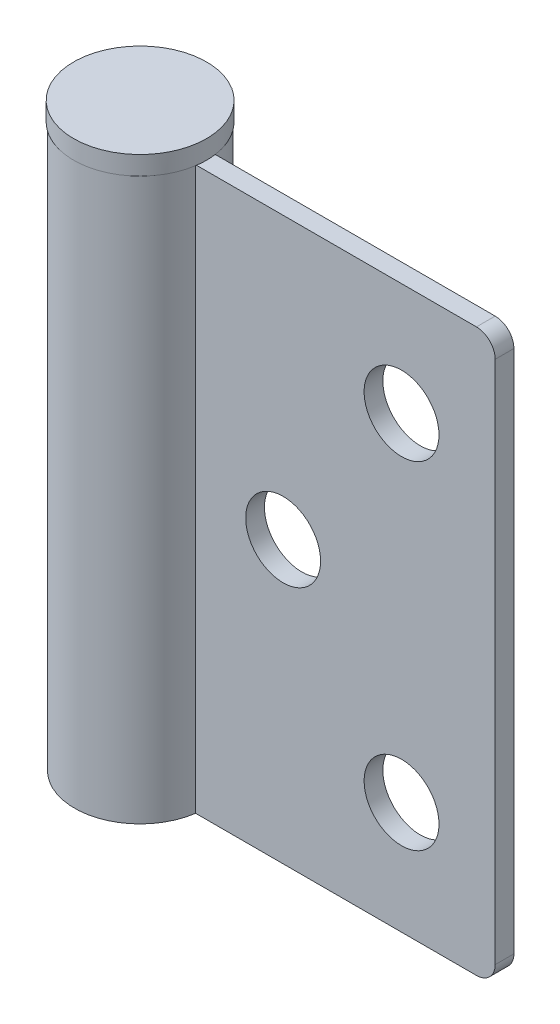
ISO-10303-21;
HEADER;
FILE_DESCRIPTION(('STEP AP214'),'2;1');
FILE_NAME('part.step','',(''),(''),'','','');
FILE_SCHEMA(('AUTOMOTIVE_DESIGN { 1 0 10303 214 1 1 1 1 }'));
ENDSEC;
DATA;
#1=APPLICATION_CONTEXT('core data for automotive mechanical design processes');
#2=APPLICATION_PROTOCOL_DEFINITION('international standard','automotive_design',2000,#1);
#3=PRODUCT_CONTEXT('',#1,'mechanical');
#4=PRODUCT('Part','Part','',(#3));
#5=PRODUCT_RELATED_PRODUCT_CATEGORY('part','',(#4));
#6=PRODUCT_DEFINITION_FORMATION('','',#4);
#7=PRODUCT_DEFINITION_CONTEXT('part definition',#1,'design');
#8=PRODUCT_DEFINITION('design','',#6,#7);
#9=PRODUCT_DEFINITION_SHAPE('','',#8);
#10=(LENGTH_UNIT() NAMED_UNIT(*) SI_UNIT(.MILLI.,.METRE.));
#11=(NAMED_UNIT(*) PLANE_ANGLE_UNIT() SI_UNIT($,.RADIAN.));
#12=(NAMED_UNIT(*) SI_UNIT($,.STERADIAN.) SOLID_ANGLE_UNIT());
#13=UNCERTAINTY_MEASURE_WITH_UNIT(LENGTH_MEASURE(1.E-05),#10,'distance_accuracy_value','');
#14=(GEOMETRIC_REPRESENTATION_CONTEXT(3) GLOBAL_UNCERTAINTY_ASSIGNED_CONTEXT((#13)) GLOBAL_UNIT_ASSIGNED_CONTEXT((#10,
#11,#12)) REPRESENTATION_CONTEXT('',''));
#15=CARTESIAN_POINT('',(0.,0.,0.));
#16=DIRECTION('',(0.,0.,1.));
#17=DIRECTION('',(1.,0.,0.));
#18=AXIS2_PLACEMENT_3D('',#15,#16,#17);
#19=CARTESIAN_POINT('',(0.,30.,0.));
#20=DIRECTION('',(0.,1.,0.));
#21=DIRECTION('',(0.,0.,1.));
#22=AXIS2_PLACEMENT_3D('',#19,#20,#21);
#23=PLANE('',#22);
#24=DIRECTION('',(-1.,0.,0.));
#25=VECTOR('',#24,1.);
#26=CARTESIAN_POINT('',(19.4641016151378,30.,-0.500000000000001));
#27=LINE('',#26,#25);
#28=CARTESIAN_POINT('',(18.4641016151378,30.,-0.500000000000001));
#29=VERTEX_POINT('',#28);
#30=CARTESIAN_POINT('',(3.514612354158,30.,-0.499999999999999));
#31=VERTEX_POINT('',#30);
#32=EDGE_CURVE('E111',#29,#31,#27,.T.);
#33=ORIENTED_EDGE('',*,*,#32,.T.);
#34=CARTESIAN_POINT('',(0.,30.,0.));
#35=DIRECTION('',(0.,1.,0.));
#36=DIRECTION('',(0.,0.,1.));
#37=AXIS2_PLACEMENT_3D('',#34,#35,#36);
#38=CIRCLE('',#37,3.55);
#39=CARTESIAN_POINT('',(3.514612354158,30.,0.500000000000001));
#40=VERTEX_POINT('',#39);
#41=EDGE_CURVE('E50',#40,#31,#38,.T.);
#42=ORIENTED_EDGE('',*,*,#41,.F.);
#43=DIRECTION('',(1.,0.,0.));
#44=VECTOR('',#43,1.);
#45=CARTESIAN_POINT('',(19.4641016151378,30.,0.499999999999999));
#46=LINE('',#45,#44);
#47=CARTESIAN_POINT('',(18.4641016151378,30.,0.499999999999999));
#48=VERTEX_POINT('',#47);
#49=EDGE_CURVE('E105',#40,#48,#46,.T.);
#50=ORIENTED_EDGE('',*,*,#49,.T.);
#51=DIRECTION('',(0.,0.,-1.));
#52=VECTOR('',#51,1.);
#53=CARTESIAN_POINT('',(18.4641016151378,30.,-0.500000000000001));
#54=LINE('',#53,#52);
#55=EDGE_CURVE('E160',#48,#29,#54,.T.);
#56=ORIENTED_EDGE('',*,*,#55,.T.);
#57=EDGE_LOOP('',(#33,#42,#50,#56));
#58=FACE_BOUND('',#57,.T.);
#59=ADVANCED_FACE('F35',(#58),#23,.T.);
#60=CARTESIAN_POINT('',(0.,0.,0.));
#61=DIRECTION('',(0.,1.,0.));
#62=DIRECTION('',(0.,0.,1.));
#63=AXIS2_PLACEMENT_3D('',#60,#61,#62);
#64=PLANE('',#63);
#65=DIRECTION('',(-1.,0.,0.));
#66=VECTOR('',#65,1.);
#67=CARTESIAN_POINT('',(19.4641016151378,0.,-0.500000000000001));
#68=LINE('',#67,#66);
#69=CARTESIAN_POINT('',(18.4641016151378,0.,-0.500000000000001));
#70=VERTEX_POINT('',#69);
#71=CARTESIAN_POINT('',(3.46410161513775,0.,-0.499999999999999));
#72=VERTEX_POINT('',#71);
#73=EDGE_CURVE('E106',#70,#72,#68,.T.);
#74=ORIENTED_EDGE('',*,*,#73,.F.);
#75=DIRECTION('',(0.,0.,-1.));
#76=VECTOR('',#75,1.);
#77=CARTESIAN_POINT('',(18.4641016151378,0.,0.));
#78=LINE('',#77,#76);
#79=CARTESIAN_POINT('',(18.4641016151378,0.,0.499999999999999));
#80=VERTEX_POINT('',#79);
#81=EDGE_CURVE('E11',#70,#80,#78,.F.);
#82=ORIENTED_EDGE('',*,*,#81,.T.);
#83=DIRECTION('',(1.,0.,0.));
#84=VECTOR('',#83,1.);
#85=CARTESIAN_POINT('',(19.4641016151378,0.,0.499999999999999));
#86=LINE('',#85,#84);
#87=CARTESIAN_POINT('',(3.46410161513776,0.,0.500000000000001));
#88=VERTEX_POINT('',#87);
#89=EDGE_CURVE('E150',#88,#80,#86,.T.);
#90=ORIENTED_EDGE('',*,*,#89,.F.);
#91=CARTESIAN_POINT('',(0.,0.,0.));
#92=DIRECTION('',(0.,1.,0.));
#93=DIRECTION('',(0.,0.,1.));
#94=AXIS2_PLACEMENT_3D('',#91,#92,#93);
#95=CIRCLE('',#94,3.5);
#96=EDGE_CURVE('E144',#72,#88,#95,.T.);
#97=ORIENTED_EDGE('',*,*,#96,.F.);
#98=EDGE_LOOP('',(#74,#82,#90,#97));
#99=FACE_BOUND('',#98,.T.);
#100=CARTESIAN_POINT('',(0.,0.,0.));
#101=DIRECTION('',(0.,1.,0.));
#102=DIRECTION('',(0.,0.,1.));
#103=AXIS2_PLACEMENT_3D('',#100,#101,#102);
#104=CIRCLE('',#103,2.5);
#105=CARTESIAN_POINT('',(0.,0.,2.5));
#106=VERTEX_POINT('',#105);
#107=EDGE_CURVE('E135',#106,#106,#104,.T.);
#108=ORIENTED_EDGE('',*,*,#107,.T.);
#109=EDGE_LOOP('',(#108));
#110=FACE_BOUND('',#109,.T.);
#111=ADVANCED_FACE('F190',(#99,#110),#64,.F.);
#112=CARTESIAN_POINT('',(0.,30.,0.));
#113=DIRECTION('',(0.,-1.,0.));
#114=DIRECTION('',(0.,0.,-1.));
#115=AXIS2_PLACEMENT_3D('',#112,#113,#114);
#116=CYLINDRICAL_SURFACE('',#115,3.5);
#117=ORIENTED_EDGE('',*,*,#96,.T.);
#118=DIRECTION('',(0.,-1.,0.));
#119=VECTOR('',#118,1.);
#120=CARTESIAN_POINT('',(3.46410161513776,30.,0.500000000000001));
#121=LINE('',#120,#119);
#122=CARTESIAN_POINT('',(3.46410161513776,30.,0.500000000000001));
#123=VERTEX_POINT('',#122);
#124=EDGE_CURVE('E102',#123,#88,#121,.T.);
#125=ORIENTED_EDGE('',*,*,#124,.F.);
#126=CARTESIAN_POINT('',(0.,30.,0.));
#127=DIRECTION('',(0.,1.,0.));
#128=DIRECTION('',(0.,0.,1.));
#129=AXIS2_PLACEMENT_3D('',#126,#127,#128);
#130=CIRCLE('',#129,3.5);
#131=CARTESIAN_POINT('',(3.46410161513776,30.,-0.499999999999999));
#132=VERTEX_POINT('',#131);
#133=EDGE_CURVE('E96',#132,#123,#130,.T.);
#134=ORIENTED_EDGE('',*,*,#133,.F.);
#135=DIRECTION('',(0.,-1.,0.));
#136=VECTOR('',#135,1.);
#137=CARTESIAN_POINT('',(3.46410161513775,30.,-0.499999999999999));
#138=LINE('',#137,#136);
#139=EDGE_CURVE('E99',#132,#72,#138,.T.);
#140=ORIENTED_EDGE('',*,*,#139,.T.);
#141=EDGE_LOOP('',(#117,#125,#134,#140));
#142=FACE_BOUND('',#141,.T.);
#143=ADVANCED_FACE('F98',(#142),#116,.T.);
#144=CARTESIAN_POINT('',(19.4641016151378,30.,0.499999999999999));
#145=DIRECTION('',(0.,0.,-1.));
#146=DIRECTION('',(-1.,0.,0.));
#147=AXIS2_PLACEMENT_3D('',#144,#145,#146);
#148=PLANE('',#147);
#149=CARTESIAN_POINT('',(14.4641016151377,24.,0.500000000000001));
#150=DIRECTION('',(0.,0.,1.));
#151=DIRECTION('',(1.,0.,0.));
#152=AXIS2_PLACEMENT_3D('',#149,#150,#151);
#153=CIRCLE('',#152,2.);
#154=CARTESIAN_POINT('',(16.4641016151377,24.,0.500000000000001));
#155=VERTEX_POINT('',#154);
#156=EDGE_CURVE('E128',#155,#155,#153,.T.);
#157=ORIENTED_EDGE('',*,*,#156,.F.);
#158=EDGE_LOOP('',(#157));
#159=FACE_BOUND('',#158,.T.);
#160=CARTESIAN_POINT('',(8.13954629480099,15.,0.500000000000001));
#161=DIRECTION('',(0.,0.,1.));
#162=DIRECTION('',(1.,0.,0.));
#163=AXIS2_PLACEMENT_3D('',#160,#161,#162);
#164=CIRCLE('',#163,2.);
#165=CARTESIAN_POINT('',(10.139546294801,15.,0.500000000000001));
#166=VERTEX_POINT('',#165);
#167=EDGE_CURVE('E136',#166,#166,#164,.T.);
#168=ORIENTED_EDGE('',*,*,#167,.F.);
#169=EDGE_LOOP('',(#168));
#170=FACE_BOUND('',#169,.T.);
#171=CARTESIAN_POINT('',(14.4641016151378,6.,0.500000000000001));
#172=DIRECTION('',(0.,0.,1.));
#173=DIRECTION('',(-1.,0.,0.));
#174=AXIS2_PLACEMENT_3D('',#171,#172,#173);
#175=CIRCLE('',#174,2.);
#176=CARTESIAN_POINT('',(12.4641016151377,6.,0.500000000000001));
#177=VERTEX_POINT('',#176);
#178=EDGE_CURVE('E117',#177,#177,#175,.T.);
#179=ORIENTED_EDGE('',*,*,#178,.F.);
#180=EDGE_LOOP('',(#179));
#181=FACE_BOUND('',#180,.T.);
#182=DIRECTION('',(0.,-1.,0.));
#183=VECTOR('',#182,1.);
#184=CARTESIAN_POINT('',(19.4641016151378,30.,0.499999999999999));
#185=LINE('',#184,#183);
#186=CARTESIAN_POINT('',(19.4641016151378,29.,0.499999999999999));
#187=VERTEX_POINT('',#186);
#188=CARTESIAN_POINT('',(19.4641016151378,1.,0.499999999999999));
#189=VERTEX_POINT('',#188);
#190=EDGE_CURVE('E156',#187,#189,#185,.T.);
#191=ORIENTED_EDGE('',*,*,#190,.F.);
#192=CARTESIAN_POINT('',(18.4641016151378,29.,0.499999999999999));
#193=DIRECTION('',(0.,0.,-1.));
#194=DIRECTION('',(-1.,0.,0.));
#195=AXIS2_PLACEMENT_3D('',#192,#193,#194);
#196=CIRCLE('',#195,1.);
#197=EDGE_CURVE('E43',#187,#48,#196,.F.);
#198=ORIENTED_EDGE('',*,*,#197,.T.);
#199=ORIENTED_EDGE('',*,*,#49,.F.);
#200=EDGE_CURVE('E146',#123,#40,#46,.T.);
#201=ORIENTED_EDGE('',*,*,#200,.F.);
#202=ORIENTED_EDGE('',*,*,#124,.T.);
#203=ORIENTED_EDGE('',*,*,#89,.T.);
#204=CARTESIAN_POINT('',(18.4641016151378,1.,0.499999999999999));
#205=DIRECTION('',(0.,0.,-1.));
#206=DIRECTION('',(-1.,0.,0.));
#207=AXIS2_PLACEMENT_3D('',#204,#205,#206);
#208=CIRCLE('',#207,1.);
#209=EDGE_CURVE('E172',#80,#189,#208,.F.);
#210=ORIENTED_EDGE('',*,*,#209,.T.);
#211=EDGE_LOOP('',(#191,#198,#199,#201,#202,#203,#210));
#212=FACE_BOUND('',#211,.T.);
#213=ADVANCED_FACE('F178',(#159,#170,#181,#212),#148,.F.);
#214=CARTESIAN_POINT('',(19.4641016151378,30.,0.499999999999999));
#215=DIRECTION('',(-1.,0.,0.));
#216=DIRECTION('',(0.,0.,1.));
#217=AXIS2_PLACEMENT_3D('',#214,#215,#216);
#218=PLANE('',#217);
#219=DIRECTION('',(0.,-1.,0.));
#220=VECTOR('',#219,1.);
#221=CARTESIAN_POINT('',(19.4641016151378,30.,-0.500000000000001));
#222=LINE('',#221,#220);
#223=CARTESIAN_POINT('',(19.4641016151378,29.,-0.500000000000001));
#224=VERTEX_POINT('',#223);
#225=CARTESIAN_POINT('',(19.4641016151378,1.,-0.500000000000001));
#226=VERTEX_POINT('',#225);
#227=EDGE_CURVE('E110',#224,#226,#222,.T.);
#228=ORIENTED_EDGE('',*,*,#227,.F.);
#229=DIRECTION('',(0.,0.,-1.));
#230=VECTOR('',#229,1.);
#231=CARTESIAN_POINT('',(19.4641016151378,29.,0.499999999999999));
#232=LINE('',#231,#230);
#233=EDGE_CURVE('E170',#224,#187,#232,.F.);
#234=ORIENTED_EDGE('',*,*,#233,.T.);
#235=ORIENTED_EDGE('',*,*,#190,.T.);
#236=DIRECTION('',(0.,0.,-1.));
#237=VECTOR('',#236,1.);
#238=CARTESIAN_POINT('',(19.4641016151378,1.,0.499999999999999));
#239=LINE('',#238,#237);
#240=EDGE_CURVE('E167',#189,#226,#239,.T.);
#241=ORIENTED_EDGE('',*,*,#240,.T.);
#242=EDGE_LOOP('',(#228,#234,#235,#241));
#243=FACE_BOUND('',#242,.T.);
#244=ADVANCED_FACE('F184',(#243),#218,.F.);
#245=CARTESIAN_POINT('',(19.4641016151378,30.,-0.500000000000001));
#246=DIRECTION('',(0.,0.,1.));
#247=DIRECTION('',(1.,0.,0.));
#248=AXIS2_PLACEMENT_3D('',#245,#246,#247);
#249=PLANE('',#248);
#250=CARTESIAN_POINT('',(14.4641016151377,24.,-0.5));
#251=DIRECTION('',(0.,0.,1.));
#252=DIRECTION('',(1.,0.,0.));
#253=AXIS2_PLACEMENT_3D('',#250,#251,#252);
#254=CIRCLE('',#253,2.);
#255=CARTESIAN_POINT('',(16.4641016151377,24.,-0.500000000000001));
#256=VERTEX_POINT('',#255);
#257=EDGE_CURVE('E131',#256,#256,#254,.F.);
#258=ORIENTED_EDGE('',*,*,#257,.F.);
#259=EDGE_LOOP('',(#258));
#260=FACE_BOUND('',#259,.T.);
#261=CARTESIAN_POINT('',(8.13954629480099,15.,-0.5));
#262=DIRECTION('',(0.,0.,1.));
#263=DIRECTION('',(1.,0.,0.));
#264=AXIS2_PLACEMENT_3D('',#261,#262,#263);
#265=CIRCLE('',#264,2.);
#266=CARTESIAN_POINT('',(10.139546294801,15.,-0.5));
#267=VERTEX_POINT('',#266);
#268=EDGE_CURVE('E132',#267,#267,#265,.F.);
#269=ORIENTED_EDGE('',*,*,#268,.F.);
#270=EDGE_LOOP('',(#269));
#271=FACE_BOUND('',#270,.T.);
#272=CARTESIAN_POINT('',(14.4641016151378,6.,-0.5));
#273=DIRECTION('',(0.,0.,1.));
#274=DIRECTION('',(1.,0.,0.));
#275=AXIS2_PLACEMENT_3D('',#272,#273,#274);
#276=CIRCLE('',#275,2.);
#277=CARTESIAN_POINT('',(16.4641016151377,6.,-0.500000000000001));
#278=VERTEX_POINT('',#277);
#279=EDGE_CURVE('E121',#278,#278,#276,.F.);
#280=ORIENTED_EDGE('',*,*,#279,.F.);
#281=EDGE_LOOP('',(#280));
#282=FACE_BOUND('',#281,.T.);
#283=ORIENTED_EDGE('',*,*,#32,.F.);
#284=CARTESIAN_POINT('',(18.4641016151378,29.,-0.500000000000001));
#285=DIRECTION('',(0.,0.,1.));
#286=DIRECTION('',(1.,0.,0.));
#287=AXIS2_PLACEMENT_3D('',#284,#285,#286);
#288=CIRCLE('',#287,1.);
#289=EDGE_CURVE('E165',#29,#224,#288,.F.);
#290=ORIENTED_EDGE('',*,*,#289,.T.);
#291=ORIENTED_EDGE('',*,*,#227,.T.);
#292=CARTESIAN_POINT('',(18.4641016151378,1.,-0.500000000000001));
#293=DIRECTION('',(0.,0.,1.));
#294=DIRECTION('',(1.,0.,0.));
#295=AXIS2_PLACEMENT_3D('',#292,#293,#294);
#296=CIRCLE('',#295,1.);
#297=EDGE_CURVE('E163',#226,#70,#296,.F.);
#298=ORIENTED_EDGE('',*,*,#297,.T.);
#299=ORIENTED_EDGE('',*,*,#73,.T.);
#300=ORIENTED_EDGE('',*,*,#139,.F.);
#301=DIRECTION('',(-1.,0.,0.));
#302=VECTOR('',#301,1.);
#303=CARTESIAN_POINT('',(19.4641016151378,30.,-0.500000000000001));
#304=LINE('',#303,#302);
#305=EDGE_CURVE('E58',#31,#132,#304,.T.);
#306=ORIENTED_EDGE('',*,*,#305,.F.);
#307=EDGE_LOOP('',(#283,#290,#291,#298,#299,#300,#306));
#308=FACE_BOUND('',#307,.T.);
#309=ADVANCED_FACE('F108',(#260,#271,#282,#308),#249,.F.);
#310=CARTESIAN_POINT('',(0.,30.,0.));
#311=DIRECTION('',(0.,-1.,0.));
#312=DIRECTION('',(0.,0.,-1.));
#313=AXIS2_PLACEMENT_3D('',#310,#311,#312);
#314=CYLINDRICAL_SURFACE('',#313,2.5);
#315=CARTESIAN_POINT('',(0.,30.,0.));
#316=DIRECTION('',(0.,1.,0.));
#317=DIRECTION('',(0.,0.,1.));
#318=AXIS2_PLACEMENT_3D('',#315,#316,#317);
#319=CIRCLE('',#318,2.5);
#320=CARTESIAN_POINT('',(0.,30.,2.5));
#321=VERTEX_POINT('',#320);
#322=EDGE_CURVE('E118',#321,#321,#319,.T.);
#323=ORIENTED_EDGE('',*,*,#322,.T.);
#324=EDGE_LOOP('',(#323));
#325=FACE_BOUND('',#324,.T.);
#326=ORIENTED_EDGE('',*,*,#107,.F.);
#327=EDGE_LOOP('',(#326));
#328=FACE_BOUND('',#327,.T.);
#329=ADVANCED_FACE('F220',(#325,#328),#314,.F.);
#330=CARTESIAN_POINT('',(14.4641016151378,6.,-3.501));
#331=DIRECTION('',(0.,0.,1.));
#332=DIRECTION('',(1.,0.,0.));
#333=AXIS2_PLACEMENT_3D('',#330,#331,#332);
#334=CYLINDRICAL_SURFACE('',#333,2.);
#335=ORIENTED_EDGE('',*,*,#178,.T.);
#336=EDGE_LOOP('',(#335));
#337=FACE_BOUND('',#336,.T.);
#338=ORIENTED_EDGE('',*,*,#279,.T.);
#339=EDGE_LOOP('',(#338));
#340=FACE_BOUND('',#339,.T.);
#341=ADVANCED_FACE('F242',(#337,#340),#334,.F.);
#342=CARTESIAN_POINT('',(8.13954629480099,15.,-3.501));
#343=DIRECTION('',(0.,0.,1.));
#344=DIRECTION('',(1.,0.,0.));
#345=AXIS2_PLACEMENT_3D('',#342,#343,#344);
#346=CYLINDRICAL_SURFACE('',#345,2.);
#347=ORIENTED_EDGE('',*,*,#167,.T.);
#348=EDGE_LOOP('',(#347));
#349=FACE_BOUND('',#348,.T.);
#350=ORIENTED_EDGE('',*,*,#268,.T.);
#351=EDGE_LOOP('',(#350));
#352=FACE_BOUND('',#351,.T.);
#353=ADVANCED_FACE('F237',(#349,#352),#346,.F.);
#354=CARTESIAN_POINT('',(14.4641016151377,24.,-3.501));
#355=DIRECTION('',(0.,0.,1.));
#356=DIRECTION('',(1.,0.,0.));
#357=AXIS2_PLACEMENT_3D('',#354,#355,#356);
#358=CYLINDRICAL_SURFACE('',#357,2.);
#359=ORIENTED_EDGE('',*,*,#156,.T.);
#360=EDGE_LOOP('',(#359));
#361=FACE_BOUND('',#360,.T.);
#362=ORIENTED_EDGE('',*,*,#257,.T.);
#363=EDGE_LOOP('',(#362));
#364=FACE_BOUND('',#363,.T.);
#365=ADVANCED_FACE('F232',(#361,#364),#358,.F.);
#366=CARTESIAN_POINT('',(18.4641016151378,29.,0.));
#367=DIRECTION('',(0.,0.,1.));
#368=DIRECTION('',(1.,0.,0.));
#369=AXIS2_PLACEMENT_3D('',#366,#367,#368);
#370=CYLINDRICAL_SURFACE('',#369,1.);
#371=ORIENTED_EDGE('',*,*,#197,.F.);
#372=ORIENTED_EDGE('',*,*,#233,.F.);
#373=ORIENTED_EDGE('',*,*,#289,.F.);
#374=ORIENTED_EDGE('',*,*,#55,.F.);
#375=EDGE_LOOP('',(#371,#372,#373,#374));
#376=FACE_BOUND('',#375,.T.);
#377=ADVANCED_FACE('F181',(#376),#370,.T.);
#378=CARTESIAN_POINT('',(18.4641016151378,1.,0.499999999999999));
#379=DIRECTION('',(0.,0.,-1.));
#380=DIRECTION('',(-1.,0.,0.));
#381=AXIS2_PLACEMENT_3D('',#378,#379,#380);
#382=CYLINDRICAL_SURFACE('',#381,1.);
#383=ORIENTED_EDGE('',*,*,#209,.F.);
#384=ORIENTED_EDGE('',*,*,#81,.F.);
#385=ORIENTED_EDGE('',*,*,#297,.F.);
#386=ORIENTED_EDGE('',*,*,#240,.F.);
#387=EDGE_LOOP('',(#383,#384,#385,#386));
#388=FACE_BOUND('',#387,.T.);
#389=ADVANCED_FACE('F37',(#388),#382,.T.);
#390=CARTESIAN_POINT('',(0.,30.,0.));
#391=DIRECTION('',(0.,1.,0.));
#392=DIRECTION('',(0.,0.,1.));
#393=AXIS2_PLACEMENT_3D('',#390,#391,#392);
#394=PLANE('',#393);
#395=ORIENTED_EDGE('',*,*,#322,.F.);
#396=EDGE_LOOP('',(#395));
#397=FACE_BOUND('',#396,.T.);
#398=ADVANCED_FACE('F201',(#397),#394,.F.);
#399=CARTESIAN_POINT('',(0.,31.,0.));
#400=DIRECTION('',(0.,-1.,0.));
#401=DIRECTION('',(0.,0.,-1.));
#402=AXIS2_PLACEMENT_3D('',#399,#400,#401);
#403=CYLINDRICAL_SURFACE('',#402,3.55);
#404=CARTESIAN_POINT('',(0.,31.,0.));
#405=DIRECTION('',(0.,1.,0.));
#406=DIRECTION('',(0.,0.,1.));
#407=AXIS2_PLACEMENT_3D('',#404,#405,#406);
#408=CIRCLE('',#407,3.55);
#409=CARTESIAN_POINT('',(0.,31.,3.55));
#410=VERTEX_POINT('',#409);
#411=EDGE_CURVE('E124',#410,#410,#408,.T.);
#412=ORIENTED_EDGE('',*,*,#411,.F.);
#413=EDGE_LOOP('',(#412));
#414=FACE_BOUND('',#413,.T.);
#415=ORIENTED_EDGE('',*,*,#41,.T.);
#416=EDGE_CURVE('E116',#31,#40,#38,.T.);
#417=ORIENTED_EDGE('',*,*,#416,.T.);
#418=EDGE_LOOP('',(#415,#417));
#419=FACE_BOUND('',#418,.T.);
#420=ADVANCED_FACE('F193',(#414,#419),#403,.T.);
#421=CARTESIAN_POINT('',(0.,31.,0.));
#422=DIRECTION('',(0.,1.,0.));
#423=DIRECTION('',(0.,0.,1.));
#424=AXIS2_PLACEMENT_3D('',#421,#422,#423);
#425=PLANE('',#424);
#426=ORIENTED_EDGE('',*,*,#411,.T.);
#427=EDGE_LOOP('',(#426));
#428=FACE_BOUND('',#427,.T.);
#429=ADVANCED_FACE('F198',(#428),#425,.T.);
#430=ORIENTED_EDGE('',*,*,#133,.T.);
#431=ORIENTED_EDGE('',*,*,#200,.T.);
#432=ORIENTED_EDGE('',*,*,#416,.F.);
#433=ORIENTED_EDGE('',*,*,#305,.T.);
#434=EDGE_LOOP('',(#430,#431,#432,#433));
#435=FACE_BOUND('',#434,.T.);
#436=ADVANCED_FACE('F114',(#435),#394,.F.);
#437=CLOSED_SHELL('',(#59,#111,#143,#213,#244,#309,#329,#341,#353,#365,#377,#389,#398,#420,#429,#436));
#438=MANIFOLD_SOLID_BREP('B2',#437);
#439=ADVANCED_BREP_SHAPE_REPRESENTATION('',(#18,#438),#14);
#440=SHAPE_DEFINITION_REPRESENTATION(#9,#439);
ENDSEC;
END-ISO-10303-21;
